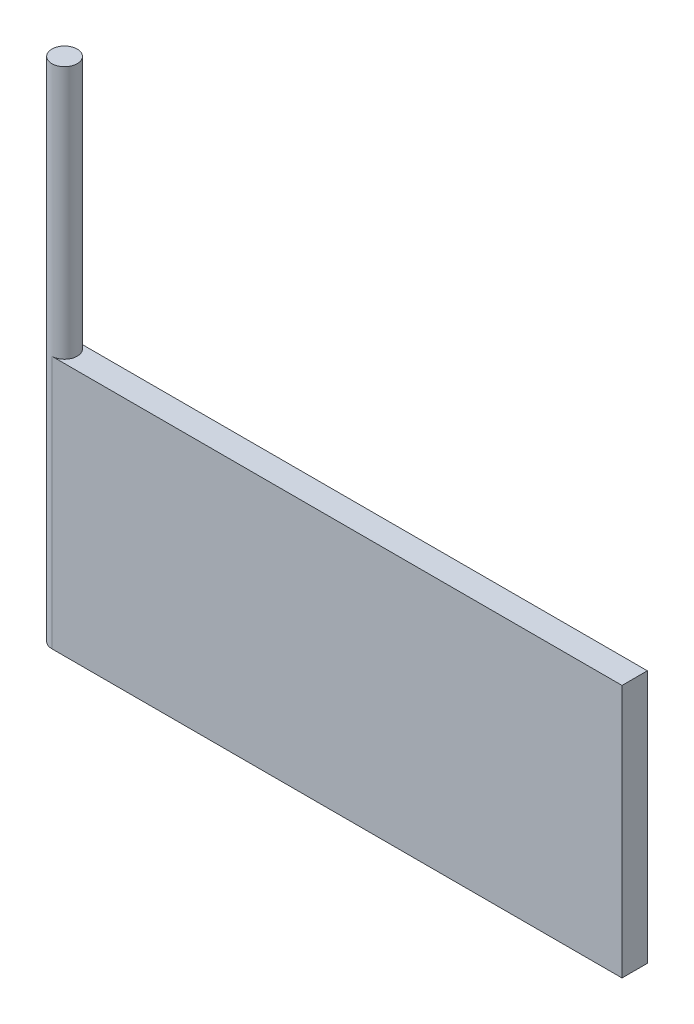
ISO-10303-21;
HEADER;
FILE_DESCRIPTION(('STEP AP214'),'2;1');
FILE_NAME('part.step','',(''),(''),'','','');
FILE_SCHEMA(('AUTOMOTIVE_DESIGN { 1 0 10303 214 1 1 1 1 }'));
ENDSEC;
DATA;
#1=APPLICATION_CONTEXT('core data for automotive mechanical design processes');
#2=APPLICATION_PROTOCOL_DEFINITION('international standard','automotive_design',2000,#1);
#3=PRODUCT_CONTEXT('',#1,'mechanical');
#4=PRODUCT('Part','Part','',(#3));
#5=PRODUCT_RELATED_PRODUCT_CATEGORY('part','',(#4));
#6=PRODUCT_DEFINITION_FORMATION('','',#4);
#7=PRODUCT_DEFINITION_CONTEXT('part definition',#1,'design');
#8=PRODUCT_DEFINITION('design','',#6,#7);
#9=PRODUCT_DEFINITION_SHAPE('','',#8);
#10=(LENGTH_UNIT() NAMED_UNIT(*) SI_UNIT(.MILLI.,.METRE.));
#11=(NAMED_UNIT(*) PLANE_ANGLE_UNIT() SI_UNIT($,.RADIAN.));
#12=(NAMED_UNIT(*) SI_UNIT($,.STERADIAN.) SOLID_ANGLE_UNIT());
#13=UNCERTAINTY_MEASURE_WITH_UNIT(LENGTH_MEASURE(1.E-05),#10,'distance_accuracy_value','');
#14=(GEOMETRIC_REPRESENTATION_CONTEXT(3) GLOBAL_UNCERTAINTY_ASSIGNED_CONTEXT((#13)) GLOBAL_UNIT_ASSIGNED_CONTEXT((#10,
#11,#12)) REPRESENTATION_CONTEXT('',''));
#15=CARTESIAN_POINT('',(0.,0.,0.));
#16=DIRECTION('',(0.,0.,1.));
#17=DIRECTION('',(1.,0.,0.));
#18=AXIS2_PLACEMENT_3D('',#15,#16,#17);
#19=CARTESIAN_POINT('',(0.,20.,-2.));
#20=DIRECTION('',(0.,1.,0.));
#21=DIRECTION('',(0.,0.,1.));
#22=AXIS2_PLACEMENT_3D('',#19,#20,#21);
#23=PLANE('',#22);
#24=CARTESIAN_POINT('',(0.,20.,0.));
#25=DIRECTION('',(0.,1.,0.));
#26=DIRECTION('',(0.,0.,1.));
#27=AXIS2_PLACEMENT_3D('',#24,#25,#26);
#28=CIRCLE('',#27,2.);
#29=CARTESIAN_POINT('',(0.,20.,2.));
#30=VERTEX_POINT('',#29);
#31=CARTESIAN_POINT('',(0.,20.,-2.));
#32=VERTEX_POINT('',#31);
#33=EDGE_CURVE('E93',#30,#32,#28,.T.);
#34=ORIENTED_EDGE('',*,*,#33,.F.);
#35=DIRECTION('',(-1.,0.,0.));
#36=VECTOR('',#35,1.);
#37=CARTESIAN_POINT('',(0.,20.,2.));
#38=LINE('',#37,#36);
#39=CARTESIAN_POINT('',(90.,20.,2.));
#40=VERTEX_POINT('',#39);
#41=EDGE_CURVE('E87',#40,#30,#38,.T.);
#42=ORIENTED_EDGE('',*,*,#41,.F.);
#43=DIRECTION('',(0.,0.,1.));
#44=VECTOR('',#43,1.);
#45=CARTESIAN_POINT('',(90.,20.,-2.));
#46=LINE('',#45,#44);
#47=CARTESIAN_POINT('',(90.,20.,-2.));
#48=VERTEX_POINT('',#47);
#49=EDGE_CURVE('E11',#48,#40,#46,.T.);
#50=ORIENTED_EDGE('',*,*,#49,.F.);
#51=DIRECTION('',(-1.,0.,0.));
#52=VECTOR('',#51,1.);
#53=CARTESIAN_POINT('',(0.,20.,-2.));
#54=LINE('',#53,#52);
#55=EDGE_CURVE('E107',#48,#32,#54,.T.);
#56=ORIENTED_EDGE('',*,*,#55,.T.);
#57=EDGE_LOOP('',(#34,#42,#50,#56));
#58=FACE_BOUND('',#57,.T.);
#59=ADVANCED_FACE('F43',(#58),#23,.T.);
#60=CARTESIAN_POINT('',(90.,20.,-2.));
#61=DIRECTION('',(1.,0.,0.));
#62=DIRECTION('',(0.,0.,-1.));
#63=AXIS2_PLACEMENT_3D('',#60,#61,#62);
#64=PLANE('',#63);
#65=DIRECTION('',(0.,1.,0.));
#66=VECTOR('',#65,1.);
#67=CARTESIAN_POINT('',(90.,20.,2.));
#68=LINE('',#67,#66);
#69=CARTESIAN_POINT('',(90.,-20.,2.));
#70=VERTEX_POINT('',#69);
#71=EDGE_CURVE('E77',#70,#40,#68,.T.);
#72=ORIENTED_EDGE('',*,*,#71,.F.);
#73=DIRECTION('',(0.,0.,1.));
#74=VECTOR('',#73,1.);
#75=CARTESIAN_POINT('',(90.,-20.,-2.));
#76=LINE('',#75,#74);
#77=CARTESIAN_POINT('',(90.,-20.,-2.));
#78=VERTEX_POINT('',#77);
#79=EDGE_CURVE('E47',#78,#70,#76,.T.);
#80=ORIENTED_EDGE('',*,*,#79,.F.);
#81=DIRECTION('',(0.,1.,0.));
#82=VECTOR('',#81,1.);
#83=CARTESIAN_POINT('',(90.,20.,-2.));
#84=LINE('',#83,#82);
#85=EDGE_CURVE('E80',#78,#48,#84,.T.);
#86=ORIENTED_EDGE('',*,*,#85,.T.);
#87=ORIENTED_EDGE('',*,*,#49,.T.);
#88=EDGE_LOOP('',(#72,#80,#86,#87));
#89=FACE_BOUND('',#88,.T.);
#90=ADVANCED_FACE('F76',(#89),#64,.T.);
#91=CARTESIAN_POINT('',(0.,-20.,-2.));
#92=DIRECTION('',(0.,-1.,0.));
#93=DIRECTION('',(0.,0.,-1.));
#94=AXIS2_PLACEMENT_3D('',#91,#92,#93);
#95=PLANE('',#94);
#96=DIRECTION('',(1.,0.,0.));
#97=VECTOR('',#96,1.);
#98=CARTESIAN_POINT('',(0.,-20.,2.));
#99=LINE('',#98,#97);
#100=CARTESIAN_POINT('',(0.,-20.,2.));
#101=VERTEX_POINT('',#100);
#102=EDGE_CURVE('E88',#101,#70,#99,.T.);
#103=ORIENTED_EDGE('',*,*,#102,.F.);
#104=CARTESIAN_POINT('',(0.,-20.,0.));
#105=DIRECTION('',(0.,-1.,0.));
#106=DIRECTION('',(0.,0.,-1.));
#107=AXIS2_PLACEMENT_3D('',#104,#105,#106);
#108=CIRCLE('',#107,2.);
#109=CARTESIAN_POINT('',(0.,-20.,-2.));
#110=VERTEX_POINT('',#109);
#111=EDGE_CURVE('E117',#101,#110,#108,.T.);
#112=ORIENTED_EDGE('',*,*,#111,.T.);
#113=DIRECTION('',(1.,0.,0.));
#114=VECTOR('',#113,1.);
#115=CARTESIAN_POINT('',(0.,-20.,-2.));
#116=LINE('',#115,#114);
#117=EDGE_CURVE('E99',#110,#78,#116,.T.);
#118=ORIENTED_EDGE('',*,*,#117,.T.);
#119=ORIENTED_EDGE('',*,*,#79,.T.);
#120=EDGE_LOOP('',(#103,#112,#118,#119));
#121=FACE_BOUND('',#120,.T.);
#122=ADVANCED_FACE('F45',(#121),#95,.T.);
#123=CARTESIAN_POINT('',(0.,0.,-2.));
#124=DIRECTION('',(0.,0.,1.));
#125=DIRECTION('',(1.,0.,0.));
#126=AXIS2_PLACEMENT_3D('',#123,#124,#125);
#127=PLANE('',#126);
#128=DIRECTION('',(0.,-1.,0.));
#129=VECTOR('',#128,1.);
#130=CARTESIAN_POINT('',(0.,20.,-2.));
#131=LINE('',#130,#129);
#132=EDGE_CURVE('E95',#32,#110,#131,.T.);
#133=ORIENTED_EDGE('',*,*,#132,.F.);
#134=ORIENTED_EDGE('',*,*,#55,.F.);
#135=ORIENTED_EDGE('',*,*,#85,.F.);
#136=ORIENTED_EDGE('',*,*,#117,.F.);
#137=EDGE_LOOP('',(#133,#134,#135,#136));
#138=FACE_BOUND('',#137,.T.);
#139=ADVANCED_FACE('F145',(#138),#127,.F.);
#140=CARTESIAN_POINT('',(0.,0.,2.));
#141=DIRECTION('',(0.,0.,1.));
#142=DIRECTION('',(1.,0.,0.));
#143=AXIS2_PLACEMENT_3D('',#140,#141,#142);
#144=PLANE('',#143);
#145=DIRECTION('',(0.,-1.,0.));
#146=VECTOR('',#145,1.);
#147=CARTESIAN_POINT('',(0.,20.,2.));
#148=LINE('',#147,#146);
#149=EDGE_CURVE('E104',#30,#101,#148,.T.);
#150=ORIENTED_EDGE('',*,*,#149,.T.);
#151=ORIENTED_EDGE('',*,*,#102,.T.);
#152=ORIENTED_EDGE('',*,*,#71,.T.);
#153=ORIENTED_EDGE('',*,*,#41,.T.);
#154=EDGE_LOOP('',(#150,#151,#152,#153));
#155=FACE_BOUND('',#154,.T.);
#156=ADVANCED_FACE('F85',(#155),#144,.T.);
#157=CARTESIAN_POINT('',(0.,60.,0.));
#158=DIRECTION('',(0.,-1.,0.));
#159=DIRECTION('',(0.,0.,-1.));
#160=AXIS2_PLACEMENT_3D('',#157,#158,#159);
#161=CYLINDRICAL_SURFACE('',#160,2.);
#162=CARTESIAN_POINT('',(0.,60.,0.));
#163=DIRECTION('',(0.,-1.,0.));
#164=DIRECTION('',(0.,0.,-1.));
#165=AXIS2_PLACEMENT_3D('',#162,#163,#164);
#166=CIRCLE('',#165,2.);
#167=CARTESIAN_POINT('',(0.,60.,-2.));
#168=VERTEX_POINT('',#167);
#169=EDGE_CURVE('E116',#168,#168,#166,.T.);
#170=ORIENTED_EDGE('',*,*,#169,.T.);
#171=EDGE_LOOP('',(#170));
#172=FACE_BOUND('',#171,.T.);
#173=ORIENTED_EDGE('',*,*,#33,.T.);
#174=ORIENTED_EDGE('',*,*,#132,.T.);
#175=ORIENTED_EDGE('',*,*,#111,.F.);
#176=ORIENTED_EDGE('',*,*,#149,.F.);
#177=EDGE_LOOP('',(#173,#174,#175,#176));
#178=FACE_BOUND('',#177,.T.);
#179=ADVANCED_FACE('F125',(#172,#178),#161,.T.);
#180=CARTESIAN_POINT('',(0.,60.,0.));
#181=DIRECTION('',(0.,-1.,0.));
#182=DIRECTION('',(0.,0.,-1.));
#183=AXIS2_PLACEMENT_3D('',#180,#181,#182);
#184=PLANE('',#183);
#185=ORIENTED_EDGE('',*,*,#169,.F.);
#186=EDGE_LOOP('',(#185));
#187=FACE_BOUND('',#186,.T.);
#188=ADVANCED_FACE('F128',(#187),#184,.F.);
#189=CLOSED_SHELL('',(#59,#90,#122,#139,#156,#179,#188));
#190=MANIFOLD_SOLID_BREP('B2',#189);
#191=ADVANCED_BREP_SHAPE_REPRESENTATION('',(#18,#190),#14);
#192=SHAPE_DEFINITION_REPRESENTATION(#9,#191);
ENDSEC;
END-ISO-10303-21;
